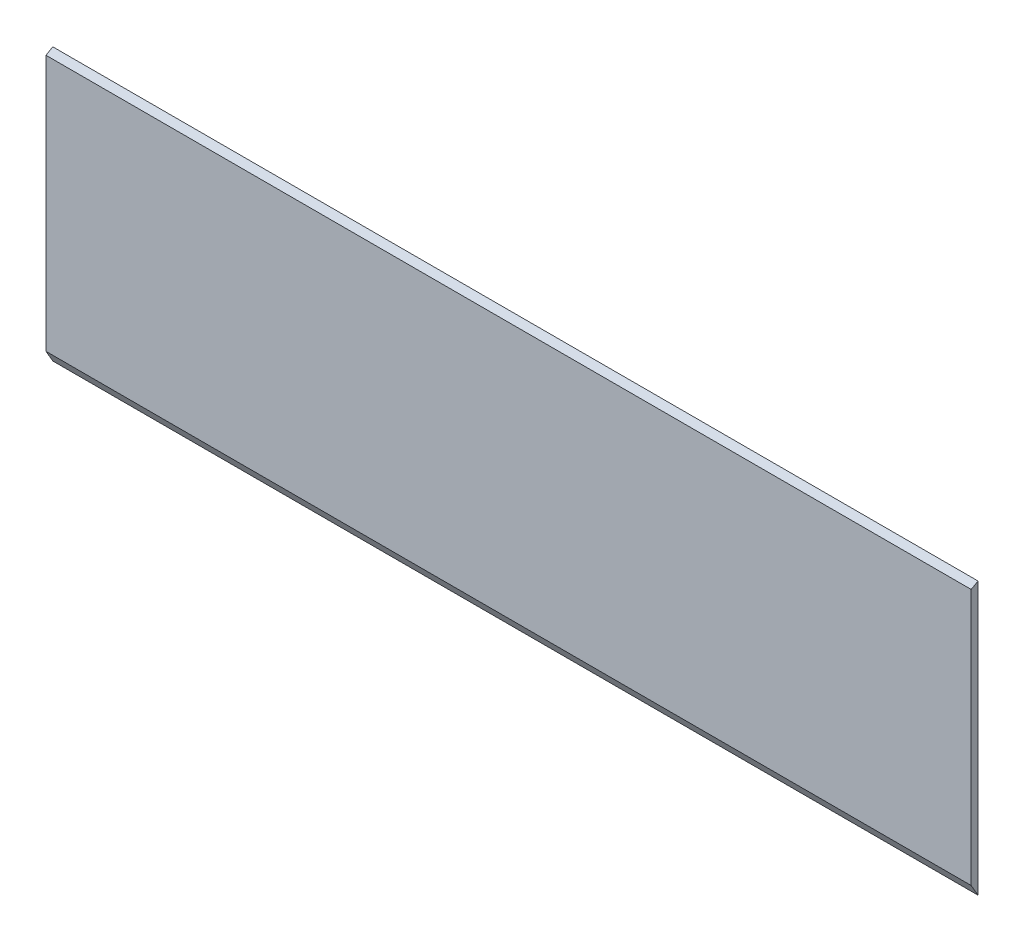
ISO-10303-21;
HEADER;
FILE_DESCRIPTION(('STEP AP214'),'2;1');
FILE_NAME('part.step','',(''),(''),'','','');
FILE_SCHEMA(('AUTOMOTIVE_DESIGN { 1 0 10303 214 1 1 1 1 }'));
ENDSEC;
DATA;
#1=APPLICATION_CONTEXT('core data for automotive mechanical design processes');
#2=APPLICATION_PROTOCOL_DEFINITION('international standard','automotive_design',2000,#1);
#3=PRODUCT_CONTEXT('',#1,'mechanical');
#4=PRODUCT('Part','Part','',(#3));
#5=PRODUCT_RELATED_PRODUCT_CATEGORY('part','',(#4));
#6=PRODUCT_DEFINITION_FORMATION('','',#4);
#7=PRODUCT_DEFINITION_CONTEXT('part definition',#1,'design');
#8=PRODUCT_DEFINITION('design','',#6,#7);
#9=PRODUCT_DEFINITION_SHAPE('','',#8);
#10=(LENGTH_UNIT() NAMED_UNIT(*) SI_UNIT(.MILLI.,.METRE.));
#11=(NAMED_UNIT(*) PLANE_ANGLE_UNIT() SI_UNIT($,.RADIAN.));
#12=(NAMED_UNIT(*) SI_UNIT($,.STERADIAN.) SOLID_ANGLE_UNIT());
#13=UNCERTAINTY_MEASURE_WITH_UNIT(LENGTH_MEASURE(1.E-05),#10,'distance_accuracy_value','');
#14=(GEOMETRIC_REPRESENTATION_CONTEXT(3) GLOBAL_UNCERTAINTY_ASSIGNED_CONTEXT((#13)) GLOBAL_UNIT_ASSIGNED_CONTEXT((#10,
#11,#12)) REPRESENTATION_CONTEXT('',''));
#15=CARTESIAN_POINT('',(0.,0.,0.));
#16=DIRECTION('',(0.,0.,1.));
#17=DIRECTION('',(1.,0.,0.));
#18=AXIS2_PLACEMENT_3D('',#15,#16,#17);
#19=CARTESIAN_POINT('',(0.,0.,3.175));
#20=DIRECTION('',(1.,0.,0.));
#21=DIRECTION('',(0.,0.,-1.));
#22=AXIS2_PLACEMENT_3D('',#19,#20,#21);
#23=PLANE('',#22);
#24=DIRECTION('',(0.,-1.,0.));
#25=VECTOR('',#24,1.);
#26=CARTESIAN_POINT('',(0.,0.,3.175));
#27=LINE('',#26,#25);
#28=CARTESIAN_POINT('',(0.,125.166912895323,3.175));
#29=VERTEX_POINT('',#28);
#30=CARTESIAN_POINT('',(0.,5.49926131403111,3.175));
#31=VERTEX_POINT('',#30);
#32=EDGE_CURVE('E41',#29,#31,#27,.T.);
#33=ORIENTED_EDGE('',*,*,#32,.F.);
#34=DIRECTION('',(0.,0.499999999999993,-0.866025403784443));
#35=VECTOR('',#34,1.);
#36=CARTESIAN_POINT('',(0.,93.8751846714931,57.3738631403114));
#37=LINE('',#36,#35);
#38=CARTESIAN_POINT('',(0.,127.,0.));
#39=VERTEX_POINT('',#38);
#40=EDGE_CURVE('E87',#29,#39,#37,.T.);
#41=ORIENTED_EDGE('',*,*,#40,.T.);
#42=DIRECTION('',(0.,-1.,0.));
#43=VECTOR('',#42,1.);
#44=CARTESIAN_POINT('',(0.,0.,0.));
#45=LINE('',#44,#43);
#46=CARTESIAN_POINT('',(0.,0.,0.));
#47=VERTEX_POINT('',#46);
#48=EDGE_CURVE('E75',#39,#47,#45,.T.);
#49=ORIENTED_EDGE('',*,*,#48,.T.);
#50=DIRECTION('',(0.,0.866025403784436,0.500000000000005));
#51=VECTOR('',#50,1.);
#52=CARTESIAN_POINT('',(0.,1.37481532850781,0.793750000000016));
#53=LINE('',#52,#51);
#54=EDGE_CURVE('E84',#47,#31,#53,.T.);
#55=ORIENTED_EDGE('',*,*,#54,.T.);
#56=EDGE_LOOP('',(#33,#41,#49,#55));
#57=FACE_BOUND('',#56,.T.);
#58=ADVANCED_FACE('F33',(#57),#23,.F.);
#59=CARTESIAN_POINT('',(431.8,0.,3.175));
#60=DIRECTION('',(-1.,0.,0.));
#61=DIRECTION('',(0.,0.,1.));
#62=AXIS2_PLACEMENT_3D('',#59,#60,#61);
#63=PLANE('',#62);
#64=DIRECTION('',(0.,1.,0.));
#65=VECTOR('',#64,1.);
#66=CARTESIAN_POINT('',(431.8,0.,0.));
#67=LINE('',#66,#65);
#68=CARTESIAN_POINT('',(431.8,0.,0.));
#69=VERTEX_POINT('',#68);
#70=CARTESIAN_POINT('',(431.8,127.,0.));
#71=VERTEX_POINT('',#70);
#72=EDGE_CURVE('E92',#69,#71,#67,.T.);
#73=ORIENTED_EDGE('',*,*,#72,.T.);
#74=DIRECTION('',(0.,-0.499999999999993,0.866025403784443));
#75=VECTOR('',#74,1.);
#76=CARTESIAN_POINT('',(431.8,93.8751846714931,57.3738631403114));
#77=LINE('',#76,#75);
#78=CARTESIAN_POINT('',(431.8,125.166912895323,3.175));
#79=VERTEX_POINT('',#78);
#80=EDGE_CURVE('E49',#71,#79,#77,.T.);
#81=ORIENTED_EDGE('',*,*,#80,.T.);
#82=DIRECTION('',(0.,1.,0.));
#83=VECTOR('',#82,1.);
#84=CARTESIAN_POINT('',(431.8,0.,3.175));
#85=LINE('',#84,#83);
#86=CARTESIAN_POINT('',(431.8,5.49926131403111,3.175));
#87=VERTEX_POINT('',#86);
#88=EDGE_CURVE('E11',#87,#79,#85,.T.);
#89=ORIENTED_EDGE('',*,*,#88,.F.);
#90=DIRECTION('',(0.,-0.866025403784436,-0.500000000000005));
#91=VECTOR('',#90,1.);
#92=CARTESIAN_POINT('',(431.8,1.37481532850781,0.793750000000016));
#93=LINE('',#92,#91);
#94=EDGE_CURVE('E98',#87,#69,#93,.T.);
#95=ORIENTED_EDGE('',*,*,#94,.T.);
#96=EDGE_LOOP('',(#73,#81,#89,#95));
#97=FACE_BOUND('',#96,.T.);
#98=ADVANCED_FACE('F106',(#97),#63,.F.);
#99=CARTESIAN_POINT('',(0.,0.,3.175));
#100=DIRECTION('',(0.,0.,-1.));
#101=DIRECTION('',(-1.,0.,0.));
#102=AXIS2_PLACEMENT_3D('',#99,#100,#101);
#103=PLANE('',#102);
#104=ORIENTED_EDGE('',*,*,#88,.T.);
#105=DIRECTION('',(-1.,0.,0.));
#106=VECTOR('',#105,1.);
#107=CARTESIAN_POINT('',(1534.1754313276,125.166912895323,3.175));
#108=LINE('',#107,#106);
#109=EDGE_CURVE('E55',#79,#29,#108,.T.);
#110=ORIENTED_EDGE('',*,*,#109,.T.);
#111=ORIENTED_EDGE('',*,*,#32,.T.);
#112=DIRECTION('',(1.,0.,0.));
#113=VECTOR('',#112,1.);
#114=CARTESIAN_POINT('',(-562.625431327595,5.49926131403111,3.175));
#115=LINE('',#114,#113);
#116=EDGE_CURVE('E89',#31,#87,#115,.T.);
#117=ORIENTED_EDGE('',*,*,#116,.T.);
#118=EDGE_LOOP('',(#104,#110,#111,#117));
#119=FACE_BOUND('',#118,.T.);
#120=ADVANCED_FACE('F103',(#119),#103,.F.);
#121=CARTESIAN_POINT('',(0.,0.,0.));
#122=DIRECTION('',(0.,0.,-1.));
#123=DIRECTION('',(-1.,0.,0.));
#124=AXIS2_PLACEMENT_3D('',#121,#122,#123);
#125=PLANE('',#124);
#126=ORIENTED_EDGE('',*,*,#48,.F.);
#127=DIRECTION('',(-1.,0.,0.));
#128=VECTOR('',#127,1.);
#129=CARTESIAN_POINT('',(0.,127.,0.));
#130=LINE('',#129,#128);
#131=EDGE_CURVE('E36',#71,#39,#130,.T.);
#132=ORIENTED_EDGE('',*,*,#131,.F.);
#133=ORIENTED_EDGE('',*,*,#72,.F.);
#134=DIRECTION('',(1.,0.,0.));
#135=VECTOR('',#134,1.);
#136=CARTESIAN_POINT('',(0.,0.,0.));
#137=LINE('',#136,#135);
#138=EDGE_CURVE('E80',#47,#69,#137,.T.);
#139=ORIENTED_EDGE('',*,*,#138,.F.);
#140=EDGE_LOOP('',(#126,#132,#133,#139));
#141=FACE_BOUND('',#140,.T.);
#142=ADVANCED_FACE('F77',(#141),#125,.T.);
#143=CARTESIAN_POINT('',(-562.625431327595,0.,0.));
#144=DIRECTION('',(0.,0.500000000000005,-0.866025403784436));
#145=DIRECTION('',(0.,0.866025403784436,0.500000000000005));
#146=AXIS2_PLACEMENT_3D('',#143,#144,#145);
#147=PLANE('',#146);
#148=ORIENTED_EDGE('',*,*,#54,.F.);
#149=ORIENTED_EDGE('',*,*,#138,.T.);
#150=ORIENTED_EDGE('',*,*,#94,.F.);
#151=ORIENTED_EDGE('',*,*,#116,.F.);
#152=EDGE_LOOP('',(#148,#149,#150,#151));
#153=FACE_BOUND('',#152,.T.);
#154=ADVANCED_FACE('F107',(#153),#147,.F.);
#155=CARTESIAN_POINT('',(1534.1754313276,127.,0.));
#156=DIRECTION('',(0.,-0.866025403784443,-0.499999999999993));
#157=DIRECTION('',(0.,0.499999999999993,-0.866025403784443));
#158=AXIS2_PLACEMENT_3D('',#155,#156,#157);
#159=PLANE('',#158);
#160=ORIENTED_EDGE('',*,*,#40,.F.);
#161=ORIENTED_EDGE('',*,*,#109,.F.);
#162=ORIENTED_EDGE('',*,*,#80,.F.);
#163=ORIENTED_EDGE('',*,*,#131,.T.);
#164=EDGE_LOOP('',(#160,#161,#162,#163));
#165=FACE_BOUND('',#164,.T.);
#166=ADVANCED_FACE('F91',(#165),#159,.F.);
#167=CLOSED_SHELL('',(#58,#98,#120,#142,#154,#166));
#168=MANIFOLD_SOLID_BREP('B2',#167);
#169=ADVANCED_BREP_SHAPE_REPRESENTATION('',(#18,#168),#14);
#170=SHAPE_DEFINITION_REPRESENTATION(#9,#169);
ENDSEC;
END-ISO-10303-21;
